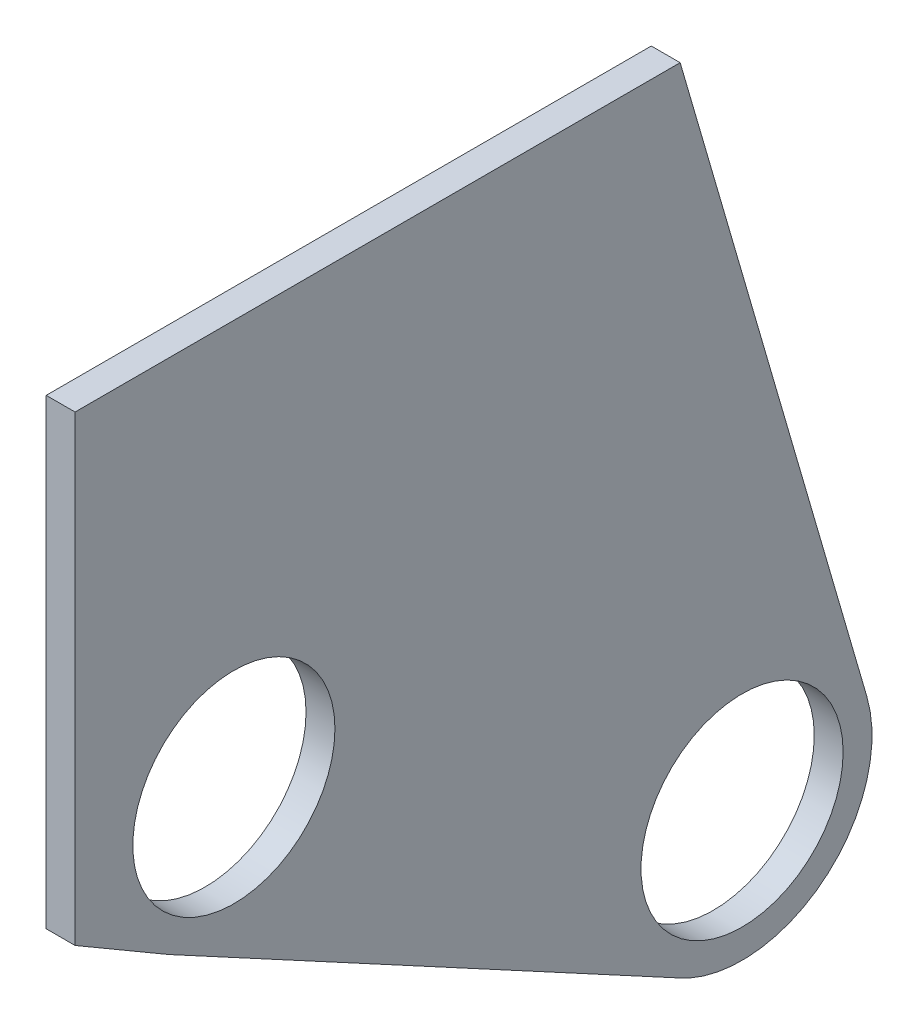
ISO-10303-21;
HEADER;
FILE_DESCRIPTION(('STEP AP214'),'2;1');
FILE_NAME('part.step','',(''),(''),'','','');
FILE_SCHEMA(('AUTOMOTIVE_DESIGN { 1 0 10303 214 1 1 1 1 }'));
ENDSEC;
DATA;
#1=APPLICATION_CONTEXT('core data for automotive mechanical design processes');
#2=APPLICATION_PROTOCOL_DEFINITION('international standard','automotive_design',2000,#1);
#3=PRODUCT_CONTEXT('',#1,'mechanical');
#4=PRODUCT('Part','Part','',(#3));
#5=PRODUCT_RELATED_PRODUCT_CATEGORY('part','',(#4));
#6=PRODUCT_DEFINITION_FORMATION('','',#4);
#7=PRODUCT_DEFINITION_CONTEXT('part definition',#1,'design');
#8=PRODUCT_DEFINITION('design','',#6,#7);
#9=PRODUCT_DEFINITION_SHAPE('','',#8);
#10=(LENGTH_UNIT() NAMED_UNIT(*) SI_UNIT(.MILLI.,.METRE.));
#11=(NAMED_UNIT(*) PLANE_ANGLE_UNIT() SI_UNIT($,.RADIAN.));
#12=(NAMED_UNIT(*) SI_UNIT($,.STERADIAN.) SOLID_ANGLE_UNIT());
#13=UNCERTAINTY_MEASURE_WITH_UNIT(LENGTH_MEASURE(1.E-05),#10,'distance_accuracy_value','');
#14=(GEOMETRIC_REPRESENTATION_CONTEXT(3) GLOBAL_UNCERTAINTY_ASSIGNED_CONTEXT((#13)) GLOBAL_UNIT_ASSIGNED_CONTEXT((#10,
#11,#12)) REPRESENTATION_CONTEXT('',''));
#15=CARTESIAN_POINT('',(0.,0.,0.));
#16=DIRECTION('',(0.,0.,1.));
#17=DIRECTION('',(1.,0.,0.));
#18=AXIS2_PLACEMENT_3D('',#15,#16,#17);
#19=CARTESIAN_POINT('',(3.175,0.,0.));
#20=DIRECTION('',(1.,0.,0.));
#21=DIRECTION('',(0.,0.,-1.));
#22=AXIS2_PLACEMENT_3D('',#19,#20,#21);
#23=PLANE('',#22);
#24=CARTESIAN_POINT('',(3.175,30.1625,55.8790980040838));
#25=DIRECTION('',(1.,0.,0.));
#26=DIRECTION('',(0.,0.,-1.));
#27=AXIS2_PLACEMENT_3D('',#24,#25,#26);
#28=CIRCLE('',#27,11.1125);
#29=CARTESIAN_POINT('',(3.175,30.1625,44.7665980040838));
#30=VERTEX_POINT('',#29);
#31=EDGE_CURVE('E128',#30,#30,#28,.T.);
#32=ORIENTED_EDGE('',*,*,#31,.F.);
#33=EDGE_LOOP('',(#32));
#34=FACE_BOUND('',#33,.T.);
#35=DIRECTION('',(0.,0.,1.));
#36=VECTOR('',#35,1.);
#37=CARTESIAN_POINT('',(3.175,74.6125,6.80967940392427));
#38=LINE('',#37,#36);
#39=CARTESIAN_POINT('',(3.175,74.6125,6.80967940392427));
#40=VERTEX_POINT('',#39);
#41=CARTESIAN_POINT('',(3.175,74.6125,73.3415980040838));
#42=VERTEX_POINT('',#41);
#43=EDGE_CURVE('E135',#40,#42,#38,.T.);
#44=ORIENTED_EDGE('',*,*,#43,.T.);
#45=DIRECTION('',(0.,-1.,0.));
#46=VECTOR('',#45,1.);
#47=CARTESIAN_POINT('',(3.175,74.6125,73.3415980040838));
#48=LINE('',#47,#46);
#49=CARTESIAN_POINT('',(3.175,23.8125,73.3415980040838));
#50=VERTEX_POINT('',#49);
#51=EDGE_CURVE('E93',#42,#50,#48,.T.);
#52=ORIENTED_EDGE('',*,*,#51,.T.);
#53=DIRECTION('',(0.,-0.504136794932909,-0.863623813934501));
#54=VECTOR('',#53,1.);
#55=CARTESIAN_POINT('',(3.175,17.8234747584108,63.0819524616877));
#56=LINE('',#55,#54);
#57=CARTESIAN_POINT('',(3.175,17.8234747584108,63.0819524616877));
#58=VERTEX_POINT('',#57);
#59=EDGE_CURVE('E106',#50,#58,#56,.T.);
#60=ORIENTED_EDGE('',*,*,#59,.T.);
#61=DIRECTION('',(0.,-0.475,-0.879985795339902));
#62=VECTOR('',#61,1.);
#63=CARTESIAN_POINT('',(3.175,-12.3390252415892,7.20285445760392));
#64=LINE('',#63,#62);
#65=CARTESIAN_POINT('',(3.175,-12.3390252415892,7.20285445760392));
#66=VERTEX_POINT('',#65);
#67=EDGE_CURVE('E100',#58,#66,#64,.T.);
#68=ORIENTED_EDGE('',*,*,#67,.T.);
#69=CARTESIAN_POINT('',(3.175,0.,0.));
#70=DIRECTION('',(1.,0.,0.));
#71=DIRECTION('',(0.,0.,-1.));
#72=AXIS2_PLACEMENT_3D('',#69,#70,#71);
#73=CIRCLE('',#72,14.2875);
#74=CARTESIAN_POINT('',(3.175,3.98805684455369,-13.7196231309249));
#75=VERTEX_POINT('',#74);
#76=EDGE_CURVE('E104',#66,#75,#73,.T.);
#77=ORIENTED_EDGE('',*,*,#76,.T.);
#78=DIRECTION('',(0.,0.960253587466307,0.27912908798276));
#79=VECTOR('',#78,1.);
#80=CARTESIAN_POINT('',(3.175,3.98805684455369,-13.7196231309249));
#81=LINE('',#80,#79);
#82=EDGE_CURVE('E56',#75,#40,#81,.T.);
#83=ORIENTED_EDGE('',*,*,#82,.T.);
#84=EDGE_LOOP('',(#44,#52,#60,#68,#77,#83));
#85=FACE_BOUND('',#84,.T.);
#86=CARTESIAN_POINT('',(3.175,0.,0.));
#87=DIRECTION('',(1.,0.,0.));
#88=DIRECTION('',(0.,0.,-1.));
#89=AXIS2_PLACEMENT_3D('',#86,#87,#88);
#90=CIRCLE('',#89,11.1125);
#91=CARTESIAN_POINT('',(3.175,0.,-11.1125));
#92=VERTEX_POINT('',#91);
#93=EDGE_CURVE('E177',#92,#92,#90,.T.);
#94=ORIENTED_EDGE('',*,*,#93,.F.);
#95=EDGE_LOOP('',(#94));
#96=FACE_BOUND('',#95,.T.);
#97=ADVANCED_FACE('F39',(#34,#85,#96),#23,.T.);
#98=CARTESIAN_POINT('',(0.,0.,0.));
#99=DIRECTION('',(1.,0.,0.));
#100=DIRECTION('',(0.,0.,-1.));
#101=AXIS2_PLACEMENT_3D('',#98,#99,#100);
#102=PLANE('',#101);
#103=DIRECTION('',(0.,0.,1.));
#104=VECTOR('',#103,1.);
#105=CARTESIAN_POINT('',(0.,74.6125,6.80967940392427));
#106=LINE('',#105,#104);
#107=CARTESIAN_POINT('',(0.,74.6125,6.80967940392427));
#108=VERTEX_POINT('',#107);
#109=CARTESIAN_POINT('',(0.,74.6125,73.3415980040838));
#110=VERTEX_POINT('',#109);
#111=EDGE_CURVE('E124',#108,#110,#106,.T.);
#112=ORIENTED_EDGE('',*,*,#111,.F.);
#113=DIRECTION('',(0.,0.960253587466307,0.27912908798276));
#114=VECTOR('',#113,1.);
#115=CARTESIAN_POINT('',(0.,3.98805684455369,-13.7196231309249));
#116=LINE('',#115,#114);
#117=CARTESIAN_POINT('',(0.,3.98805684455369,-13.7196231309249));
#118=VERTEX_POINT('',#117);
#119=EDGE_CURVE('E85',#118,#108,#116,.T.);
#120=ORIENTED_EDGE('',*,*,#119,.F.);
#121=CARTESIAN_POINT('',(0.,0.,0.));
#122=DIRECTION('',(1.,0.,0.));
#123=DIRECTION('',(0.,0.,-1.));
#124=AXIS2_PLACEMENT_3D('',#121,#122,#123);
#125=CIRCLE('',#124,14.2875);
#126=CARTESIAN_POINT('',(0.,-12.3390252415892,7.20285445760392));
#127=VERTEX_POINT('',#126);
#128=EDGE_CURVE('E79',#127,#118,#125,.T.);
#129=ORIENTED_EDGE('',*,*,#128,.F.);
#130=DIRECTION('',(0.,-0.475,-0.879985795339902));
#131=VECTOR('',#130,1.);
#132=CARTESIAN_POINT('',(0.,-12.3390252415892,7.20285445760392));
#133=LINE('',#132,#131);
#134=CARTESIAN_POINT('',(0.,17.8234747584108,63.0819524616877));
#135=VERTEX_POINT('',#134);
#136=EDGE_CURVE('E114',#135,#127,#133,.T.);
#137=ORIENTED_EDGE('',*,*,#136,.F.);
#138=DIRECTION('',(0.,-0.504136794932909,-0.863623813934501));
#139=VECTOR('',#138,1.);
#140=CARTESIAN_POINT('',(0.,17.8234747584108,63.0819524616877));
#141=LINE('',#140,#139);
#142=CARTESIAN_POINT('',(0.,23.8125,73.3415980040838));
#143=VERTEX_POINT('',#142);
#144=EDGE_CURVE('E130',#143,#135,#141,.T.);
#145=ORIENTED_EDGE('',*,*,#144,.F.);
#146=DIRECTION('',(0.,-1.,0.));
#147=VECTOR('',#146,1.);
#148=CARTESIAN_POINT('',(0.,74.6125,73.3415980040838));
#149=LINE('',#148,#147);
#150=EDGE_CURVE('E127',#110,#143,#149,.T.);
#151=ORIENTED_EDGE('',*,*,#150,.F.);
#152=EDGE_LOOP('',(#112,#120,#129,#137,#145,#151));
#153=FACE_BOUND('',#152,.T.);
#154=CARTESIAN_POINT('',(0.,30.1625,55.8790980040838));
#155=DIRECTION('',(1.,0.,0.));
#156=DIRECTION('',(0.,0.,-1.));
#157=AXIS2_PLACEMENT_3D('',#154,#155,#156);
#158=CIRCLE('',#157,11.1125);
#159=CARTESIAN_POINT('',(0.,30.1625,44.7665980040838));
#160=VERTEX_POINT('',#159);
#161=EDGE_CURVE('E183',#160,#160,#158,.T.);
#162=ORIENTED_EDGE('',*,*,#161,.T.);
#163=EDGE_LOOP('',(#162));
#164=FACE_BOUND('',#163,.T.);
#165=CARTESIAN_POINT('',(0.,0.,0.));
#166=DIRECTION('',(1.,0.,0.));
#167=DIRECTION('',(0.,0.,-1.));
#168=AXIS2_PLACEMENT_3D('',#165,#166,#167);
#169=CIRCLE('',#168,11.1125);
#170=CARTESIAN_POINT('',(0.,0.,-11.1125));
#171=VERTEX_POINT('',#170);
#172=EDGE_CURVE('E180',#171,#171,#169,.T.);
#173=ORIENTED_EDGE('',*,*,#172,.T.);
#174=EDGE_LOOP('',(#173));
#175=FACE_BOUND('',#174,.T.);
#176=ADVANCED_FACE('F144',(#153,#164,#175),#102,.F.);
#177=CARTESIAN_POINT('',(3.175,74.6125,6.80967940392427));
#178=DIRECTION('',(0.,-1.,0.));
#179=DIRECTION('',(0.,0.,-1.));
#180=AXIS2_PLACEMENT_3D('',#177,#178,#179);
#181=PLANE('',#180);
#182=ORIENTED_EDGE('',*,*,#111,.T.);
#183=DIRECTION('',(-1.,0.,0.));
#184=VECTOR('',#183,1.);
#185=CARTESIAN_POINT('',(3.175,74.6125,73.3415980040838));
#186=LINE('',#185,#184);
#187=EDGE_CURVE('E11',#42,#110,#186,.T.);
#188=ORIENTED_EDGE('',*,*,#187,.F.);
#189=ORIENTED_EDGE('',*,*,#43,.F.);
#190=DIRECTION('',(-1.,0.,0.));
#191=VECTOR('',#190,1.);
#192=CARTESIAN_POINT('',(3.175,74.6125,6.80967940392427));
#193=LINE('',#192,#191);
#194=EDGE_CURVE('E120',#40,#108,#193,.T.);
#195=ORIENTED_EDGE('',*,*,#194,.T.);
#196=EDGE_LOOP('',(#182,#188,#189,#195));
#197=FACE_BOUND('',#196,.T.);
#198=ADVANCED_FACE('F41',(#197),#181,.F.);
#199=CARTESIAN_POINT('',(3.175,74.6125,73.3415980040838));
#200=DIRECTION('',(0.,0.,-1.));
#201=DIRECTION('',(-1.,0.,0.));
#202=AXIS2_PLACEMENT_3D('',#199,#200,#201);
#203=PLANE('',#202);
#204=ORIENTED_EDGE('',*,*,#150,.T.);
#205=DIRECTION('',(-1.,0.,0.));
#206=VECTOR('',#205,1.);
#207=CARTESIAN_POINT('',(3.175,23.8125,73.3415980040838));
#208=LINE('',#207,#206);
#209=EDGE_CURVE('E48',#50,#143,#208,.T.);
#210=ORIENTED_EDGE('',*,*,#209,.F.);
#211=ORIENTED_EDGE('',*,*,#51,.F.);
#212=ORIENTED_EDGE('',*,*,#187,.T.);
#213=EDGE_LOOP('',(#204,#210,#211,#212));
#214=FACE_BOUND('',#213,.T.);
#215=ADVANCED_FACE('F228',(#214),#203,.F.);
#216=CARTESIAN_POINT('',(3.175,17.8234747584108,63.0819524616877));
#217=DIRECTION('',(0.,0.863623813934501,-0.504136794932909));
#218=DIRECTION('',(0.,0.50413679493291,0.863623813934501));
#219=AXIS2_PLACEMENT_3D('',#216,#217,#218);
#220=PLANE('',#219);
#221=ORIENTED_EDGE('',*,*,#144,.T.);
#222=DIRECTION('',(-1.,0.,0.));
#223=VECTOR('',#222,1.);
#224=CARTESIAN_POINT('',(3.175,17.8234747584108,63.0819524616877));
#225=LINE('',#224,#223);
#226=EDGE_CURVE('E115',#58,#135,#225,.T.);
#227=ORIENTED_EDGE('',*,*,#226,.F.);
#228=ORIENTED_EDGE('',*,*,#59,.F.);
#229=ORIENTED_EDGE('',*,*,#209,.T.);
#230=EDGE_LOOP('',(#221,#227,#228,#229));
#231=FACE_BOUND('',#230,.T.);
#232=ADVANCED_FACE('F141',(#231),#220,.F.);
#233=CARTESIAN_POINT('',(3.175,-12.3390252415892,7.20285445760392));
#234=DIRECTION('',(0.,0.879985795339902,-0.475));
#235=DIRECTION('',(0.,0.475,0.879985795339902));
#236=AXIS2_PLACEMENT_3D('',#233,#234,#235);
#237=PLANE('',#236);
#238=ORIENTED_EDGE('',*,*,#136,.T.);
#239=DIRECTION('',(-1.,0.,0.));
#240=VECTOR('',#239,1.);
#241=CARTESIAN_POINT('',(3.175,-12.3390252415892,7.20285445760392));
#242=LINE('',#241,#240);
#243=EDGE_CURVE('E111',#66,#127,#242,.T.);
#244=ORIENTED_EDGE('',*,*,#243,.F.);
#245=ORIENTED_EDGE('',*,*,#67,.F.);
#246=ORIENTED_EDGE('',*,*,#226,.T.);
#247=EDGE_LOOP('',(#238,#244,#245,#246));
#248=FACE_BOUND('',#247,.T.);
#249=ADVANCED_FACE('F112',(#248),#237,.F.);
#250=CARTESIAN_POINT('',(3.175,0.,0.));
#251=DIRECTION('',(-1.,0.,0.));
#252=DIRECTION('',(0.,0.,1.));
#253=AXIS2_PLACEMENT_3D('',#250,#251,#252);
#254=CYLINDRICAL_SURFACE('',#253,14.2875);
#255=ORIENTED_EDGE('',*,*,#128,.T.);
#256=DIRECTION('',(-1.,0.,0.));
#257=VECTOR('',#256,1.);
#258=CARTESIAN_POINT('',(3.175,3.98805684455369,-13.7196231309249));
#259=LINE('',#258,#257);
#260=EDGE_CURVE('E116',#75,#118,#259,.T.);
#261=ORIENTED_EDGE('',*,*,#260,.F.);
#262=ORIENTED_EDGE('',*,*,#76,.F.);
#263=ORIENTED_EDGE('',*,*,#243,.T.);
#264=EDGE_LOOP('',(#255,#261,#262,#263));
#265=FACE_BOUND('',#264,.T.);
#266=ADVANCED_FACE('F118',(#265),#254,.T.);
#267=CARTESIAN_POINT('',(3.175,3.98805684455369,-13.7196231309249));
#268=DIRECTION('',(0.,-0.27912908798276,0.960253587466307));
#269=DIRECTION('',(0.,-0.960253587466307,-0.27912908798276));
#270=AXIS2_PLACEMENT_3D('',#267,#268,#269);
#271=PLANE('',#270);
#272=ORIENTED_EDGE('',*,*,#119,.T.);
#273=ORIENTED_EDGE('',*,*,#194,.F.);
#274=ORIENTED_EDGE('',*,*,#82,.F.);
#275=ORIENTED_EDGE('',*,*,#260,.T.);
#276=EDGE_LOOP('',(#272,#273,#274,#275));
#277=FACE_BOUND('',#276,.T.);
#278=ADVANCED_FACE('F149',(#277),#271,.F.);
#279=CARTESIAN_POINT('',(3.175,30.1625,55.8790980040838));
#280=DIRECTION('',(-1.,0.,0.));
#281=DIRECTION('',(0.,0.,1.));
#282=AXIS2_PLACEMENT_3D('',#279,#280,#281);
#283=CYLINDRICAL_SURFACE('',#282,11.1125);
#284=ORIENTED_EDGE('',*,*,#31,.T.);
#285=EDGE_LOOP('',(#284));
#286=FACE_BOUND('',#285,.T.);
#287=ORIENTED_EDGE('',*,*,#161,.F.);
#288=EDGE_LOOP('',(#287));
#289=FACE_BOUND('',#288,.T.);
#290=ADVANCED_FACE('F151',(#286,#289),#283,.F.);
#291=CARTESIAN_POINT('',(3.175,0.,0.));
#292=DIRECTION('',(-1.,0.,0.));
#293=DIRECTION('',(0.,0.,1.));
#294=AXIS2_PLACEMENT_3D('',#291,#292,#293);
#295=CYLINDRICAL_SURFACE('',#294,11.1125);
#296=ORIENTED_EDGE('',*,*,#93,.T.);
#297=EDGE_LOOP('',(#296));
#298=FACE_BOUND('',#297,.T.);
#299=ORIENTED_EDGE('',*,*,#172,.F.);
#300=EDGE_LOOP('',(#299));
#301=FACE_BOUND('',#300,.T.);
#302=ADVANCED_FACE('F157',(#298,#301),#295,.F.);
#303=CLOSED_SHELL('',(#97,#176,#198,#215,#232,#249,#266,#278,#290,#302));
#304=MANIFOLD_SOLID_BREP('B2',#303);
#305=ADVANCED_BREP_SHAPE_REPRESENTATION('',(#18,#304),#14);
#306=SHAPE_DEFINITION_REPRESENTATION(#9,#305);
ENDSEC;
END-ISO-10303-21;
